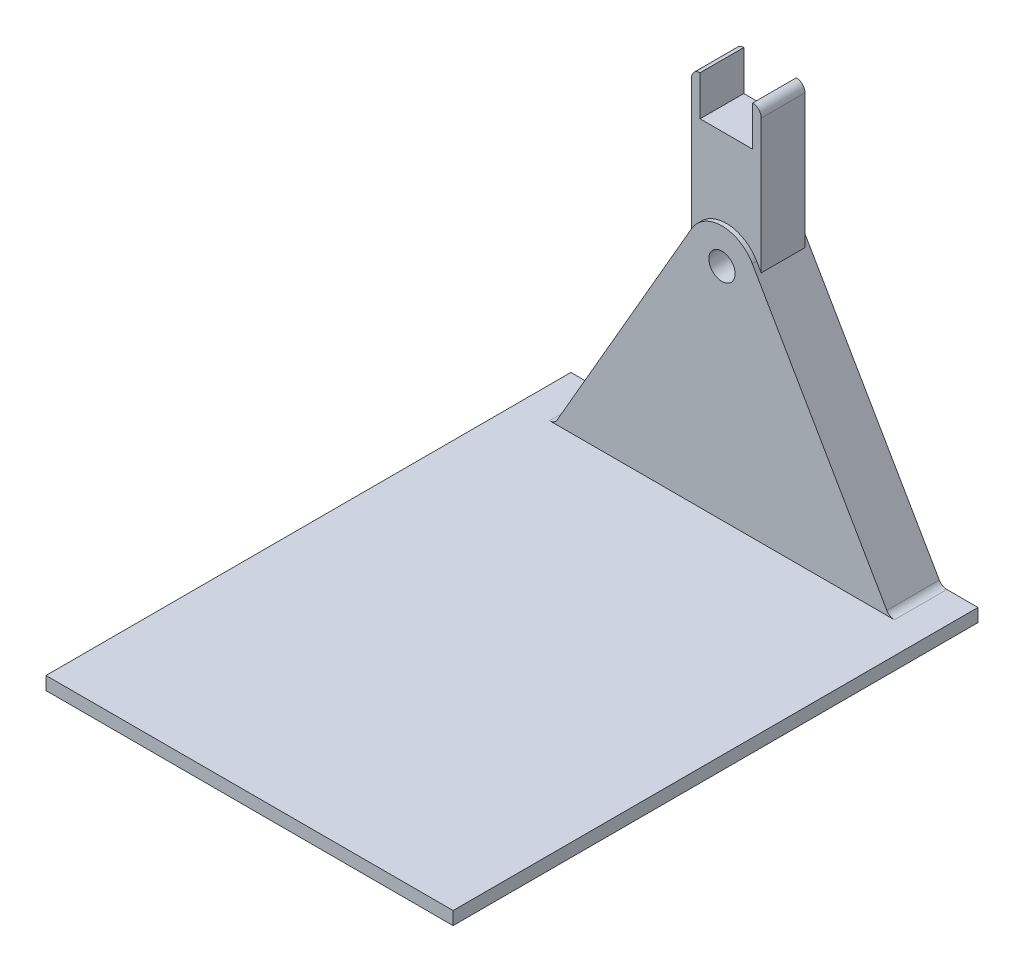
ISO-10303-21;
HEADER;
FILE_DESCRIPTION(('STEP AP214'),'2;1');
FILE_NAME('part.step','',(''),(''),'','','');
FILE_SCHEMA(('AUTOMOTIVE_DESIGN { 1 0 10303 214 1 1 1 1 }'));
ENDSEC;
DATA;
#1=APPLICATION_CONTEXT('core data for automotive mechanical design processes');
#2=APPLICATION_PROTOCOL_DEFINITION('international standard','automotive_design',2000,#1);
#3=PRODUCT_CONTEXT('',#1,'mechanical');
#4=PRODUCT('Part','Part','',(#3));
#5=PRODUCT_RELATED_PRODUCT_CATEGORY('part','',(#4));
#6=PRODUCT_DEFINITION_FORMATION('','',#4);
#7=PRODUCT_DEFINITION_CONTEXT('part definition',#1,'design');
#8=PRODUCT_DEFINITION('design','',#6,#7);
#9=PRODUCT_DEFINITION_SHAPE('','',#8);
#10=(LENGTH_UNIT() NAMED_UNIT(*) SI_UNIT(.MILLI.,.METRE.));
#11=(NAMED_UNIT(*) PLANE_ANGLE_UNIT() SI_UNIT($,.RADIAN.));
#12=(NAMED_UNIT(*) SI_UNIT($,.STERADIAN.) SOLID_ANGLE_UNIT());
#13=UNCERTAINTY_MEASURE_WITH_UNIT(LENGTH_MEASURE(1.E-05),#10,'distance_accuracy_value','');
#14=(GEOMETRIC_REPRESENTATION_CONTEXT(3) GLOBAL_UNCERTAINTY_ASSIGNED_CONTEXT((#13)) GLOBAL_UNIT_ASSIGNED_CONTEXT((#10,
#11,#12)) REPRESENTATION_CONTEXT('',''));
#15=CARTESIAN_POINT('',(0.,0.,0.));
#16=DIRECTION('',(0.,0.,1.));
#17=DIRECTION('',(1.,0.,0.));
#18=AXIS2_PLACEMENT_3D('',#15,#16,#17);
#19=CARTESIAN_POINT('',(0.,8.53692237759738,3.));
#20=DIRECTION('',(0.,0.,-1.));
#21=DIRECTION('',(-1.,0.,0.));
#22=AXIS2_PLACEMENT_3D('',#19,#20,#21);
#23=CYLINDRICAL_SURFACE('',#22,4.);
#24=CARTESIAN_POINT('',(0.,8.53692237759738,-2.5));
#25=DIRECTION('',(0.,0.,1.));
#26=DIRECTION('',(1.,0.,0.));
#27=AXIS2_PLACEMENT_3D('',#24,#25,#26);
#28=CIRCLE('',#27,4.);
#29=CARTESIAN_POINT('',(3.46410161513778,10.5369223775973,-2.5));
#30=VERTEX_POINT('',#29);
#31=CARTESIAN_POINT('',(-3.46410161513778,10.5369223775973,-2.5));
#32=VERTEX_POINT('',#31);
#33=EDGE_CURVE('E274',#30,#32,#28,.T.);
#34=ORIENTED_EDGE('',*,*,#33,.F.);
#35=DIRECTION('',(0.,0.,-1.));
#36=VECTOR('',#35,1.);
#37=CARTESIAN_POINT('',(3.46410161513778,10.5369223775973,3.));
#38=LINE('',#37,#36);
#39=CARTESIAN_POINT('',(3.46410161513778,10.5369223775973,-3.));
#40=VERTEX_POINT('',#39);
#41=EDGE_CURVE('E304',#30,#40,#38,.T.);
#42=ORIENTED_EDGE('',*,*,#41,.T.);
#43=CARTESIAN_POINT('',(0.,8.53692237759738,-3.));
#44=DIRECTION('',(0.,0.,1.));
#45=DIRECTION('',(1.,0.,0.));
#46=AXIS2_PLACEMENT_3D('',#43,#44,#45);
#47=CIRCLE('',#46,4.);
#48=CARTESIAN_POINT('',(-3.46410161513778,10.5369223775973,-3.));
#49=VERTEX_POINT('',#48);
#50=EDGE_CURVE('E294',#40,#49,#47,.T.);
#51=ORIENTED_EDGE('',*,*,#50,.T.);
#52=DIRECTION('',(0.,0.,-1.));
#53=VECTOR('',#52,1.);
#54=CARTESIAN_POINT('',(-3.46410161513778,10.5369223775973,3.));
#55=LINE('',#54,#53);
#56=EDGE_CURVE('E292',#32,#49,#55,.T.);
#57=ORIENTED_EDGE('',*,*,#56,.F.);
#58=EDGE_LOOP('',(#34,#42,#51,#57));
#59=FACE_BOUND('',#58,.T.);
#60=ADVANCED_FACE('F37',(#59),#23,.T.);
#61=CARTESIAN_POINT('',(7.16069743970534,4.13423059439934,3.));
#62=DIRECTION('',(0.866025403784439,0.5,0.));
#63=DIRECTION('',(-0.5,0.866025403784439,0.));
#64=AXIS2_PLACEMENT_3D('',#61,#62,#63);
#65=PLANE('',#64);
#66=DIRECTION('',(0.5,-0.866025403784439,0.));
#67=VECTOR('',#66,1.);
#68=CARTESIAN_POINT('',(7.16069743970534,4.13423059439934,3.));
#69=LINE('',#68,#67);
#70=CARTESIAN_POINT('',(3.46410161513778,10.5369223775973,3.));
#71=VERTEX_POINT('',#70);
#72=CARTESIAN_POINT('',(18.8452994616208,-16.1040937737802,3.));
#73=VERTEX_POINT('',#72);
#74=EDGE_CURVE('E285',#71,#73,#69,.T.);
#75=ORIENTED_EDGE('',*,*,#74,.T.);
#76=DIRECTION('',(0.,0.,-1.));
#77=VECTOR('',#76,1.);
#78=CARTESIAN_POINT('',(18.8452994616207,-16.1040937737802,-3.));
#79=LINE('',#78,#77);
#80=CARTESIAN_POINT('',(18.8452994616208,-16.1040937737802,-3.));
#81=VERTEX_POINT('',#80);
#82=EDGE_CURVE('E323',#73,#81,#79,.T.);
#83=ORIENTED_EDGE('',*,*,#82,.T.);
#84=DIRECTION('',(0.5,-0.866025403784439,0.));
#85=VECTOR('',#84,1.);
#86=CARTESIAN_POINT('',(7.16069743970534,4.13423059439934,-3.));
#87=LINE('',#86,#85);
#88=EDGE_CURVE('E284',#40,#81,#87,.T.);
#89=ORIENTED_EDGE('',*,*,#88,.F.);
#90=ORIENTED_EDGE('',*,*,#41,.F.);
#91=DIRECTION('',(0.5,-0.866025403784439,0.));
#92=VECTOR('',#91,1.);
#93=CARTESIAN_POINT('',(7.16069743970534,4.13423059439934,-2.5));
#94=LINE('',#93,#92);
#95=CARTESIAN_POINT('',(3.98839196034118,9.62882486178722,-2.5));
#96=VERTEX_POINT('',#95);
#97=EDGE_CURVE('E277',#30,#96,#94,.T.);
#98=ORIENTED_EDGE('',*,*,#97,.T.);
#99=DIRECTION('',(0.,0.,1.));
#100=VECTOR('',#99,1.);
#101=CARTESIAN_POINT('',(3.98839196034118,9.62882486178722,3.));
#102=LINE('',#101,#100);
#103=CARTESIAN_POINT('',(3.98839196034118,9.62882486178722,2.5));
#104=VERTEX_POINT('',#103);
#105=EDGE_CURVE('E315',#96,#104,#102,.T.);
#106=ORIENTED_EDGE('',*,*,#105,.T.);
#107=DIRECTION('',(0.5,-0.866025403784439,0.));
#108=VECTOR('',#107,1.);
#109=CARTESIAN_POINT('',(7.16069743970534,4.13423059439934,2.5));
#110=LINE('',#109,#108);
#111=CARTESIAN_POINT('',(3.46410161513778,10.5369223775973,2.5));
#112=VERTEX_POINT('',#111);
#113=EDGE_CURVE('E281',#112,#104,#110,.T.);
#114=ORIENTED_EDGE('',*,*,#113,.F.);
#115=EDGE_CURVE('E305',#71,#112,#38,.T.);
#116=ORIENTED_EDGE('',*,*,#115,.F.);
#117=EDGE_LOOP('',(#75,#83,#89,#90,#98,#106,#114,#116));
#118=FACE_BOUND('',#117,.T.);
#119=ADVANCED_FACE('F335',(#118),#65,.T.);
#120=ORIENTED_EDGE('',*,*,#115,.T.);
#121=CARTESIAN_POINT('',(0.,8.53692237759738,2.5));
#122=DIRECTION('',(0.,0.,1.));
#123=DIRECTION('',(1.,0.,0.));
#124=AXIS2_PLACEMENT_3D('',#121,#122,#123);
#125=CIRCLE('',#124,4.);
#126=CARTESIAN_POINT('',(-3.46410161513778,10.5369223775973,2.5));
#127=VERTEX_POINT('',#126);
#128=EDGE_CURVE('E279',#112,#127,#125,.T.);
#129=ORIENTED_EDGE('',*,*,#128,.T.);
#130=CARTESIAN_POINT('',(-3.46410161513778,10.5369223775973,3.));
#131=VERTEX_POINT('',#130);
#132=EDGE_CURVE('E301',#131,#127,#55,.T.);
#133=ORIENTED_EDGE('',*,*,#132,.F.);
#134=CARTESIAN_POINT('',(0.,8.53692237759738,3.));
#135=DIRECTION('',(0.,0.,1.));
#136=DIRECTION('',(1.,0.,0.));
#137=AXIS2_PLACEMENT_3D('',#134,#135,#136);
#138=CIRCLE('',#137,4.);
#139=EDGE_CURVE('E287',#71,#131,#138,.T.);
#140=ORIENTED_EDGE('',*,*,#139,.F.);
#141=EDGE_LOOP('',(#120,#129,#133,#140));
#142=FACE_BOUND('',#141,.T.);
#143=ADVANCED_FACE('F343',(#142),#23,.T.);
#144=CARTESIAN_POINT('',(-7.16069743970534,4.13423059439934,3.));
#145=DIRECTION('',(0.866025403784439,-0.5,0.));
#146=DIRECTION('',(0.5,0.866025403784439,0.));
#147=AXIS2_PLACEMENT_3D('',#144,#145,#146);
#148=PLANE('',#147);
#149=DIRECTION('',(-0.5,-0.866025403784439,0.));
#150=VECTOR('',#149,1.);
#151=CARTESIAN_POINT('',(-7.16069743970534,4.13423059439934,-3.));
#152=LINE('',#151,#150);
#153=CARTESIAN_POINT('',(-18.8452994616207,-16.1040937737802,-3.));
#154=VERTEX_POINT('',#153);
#155=EDGE_CURVE('E297',#49,#154,#152,.T.);
#156=ORIENTED_EDGE('',*,*,#155,.T.);
#157=DIRECTION('',(0.,0.,-1.));
#158=VECTOR('',#157,1.);
#159=CARTESIAN_POINT('',(-18.8452994616207,-16.1040937737802,3.));
#160=LINE('',#159,#158);
#161=CARTESIAN_POINT('',(-18.8452994616207,-16.1040937737802,3.));
#162=VERTEX_POINT('',#161);
#163=EDGE_CURVE('E321',#154,#162,#160,.F.);
#164=ORIENTED_EDGE('',*,*,#163,.T.);
#165=DIRECTION('',(-0.5,-0.866025403784439,0.));
#166=VECTOR('',#165,1.);
#167=CARTESIAN_POINT('',(-7.16069743970534,4.13423059439934,3.));
#168=LINE('',#167,#166);
#169=EDGE_CURVE('E289',#131,#162,#168,.T.);
#170=ORIENTED_EDGE('',*,*,#169,.F.);
#171=ORIENTED_EDGE('',*,*,#132,.T.);
#172=DIRECTION('',(-0.5,-0.866025403784439,0.));
#173=VECTOR('',#172,1.);
#174=CARTESIAN_POINT('',(-7.16069743970534,4.13423059439934,2.5));
#175=LINE('',#174,#173);
#176=CARTESIAN_POINT('',(-3.98839196034118,9.62882486178722,2.5));
#177=VERTEX_POINT('',#176);
#178=EDGE_CURVE('E313',#127,#177,#175,.T.);
#179=ORIENTED_EDGE('',*,*,#178,.T.);
#180=DIRECTION('',(0.,0.,-1.));
#181=VECTOR('',#180,1.);
#182=CARTESIAN_POINT('',(-3.98839196034118,9.62882486178722,3.));
#183=LINE('',#182,#181);
#184=CARTESIAN_POINT('',(-3.98839196034118,9.62882486178722,-2.5));
#185=VERTEX_POINT('',#184);
#186=EDGE_CURVE('E311',#177,#185,#183,.T.);
#187=ORIENTED_EDGE('',*,*,#186,.T.);
#188=DIRECTION('',(-0.5,-0.866025403784439,0.));
#189=VECTOR('',#188,1.);
#190=CARTESIAN_POINT('',(-7.16069743970534,4.13423059439934,-2.5));
#191=LINE('',#190,#189);
#192=EDGE_CURVE('E308',#32,#185,#191,.T.);
#193=ORIENTED_EDGE('',*,*,#192,.F.);
#194=ORIENTED_EDGE('',*,*,#56,.T.);
#195=EDGE_LOOP('',(#156,#164,#170,#171,#179,#187,#193,#194));
#196=FACE_BOUND('',#195,.T.);
#197=ADVANCED_FACE('F347',(#196),#148,.F.);
#198=CARTESIAN_POINT('',(0.,-18.1040937737802,3.));
#199=DIRECTION('',(0.,1.,0.));
#200=DIRECTION('',(0.,0.,1.));
#201=AXIS2_PLACEMENT_3D('',#198,#199,#200);
#202=PLANE('',#201);
#203=DIRECTION('',(0.,0.,-1.));
#204=VECTOR('',#203,1.);
#205=CARTESIAN_POINT('',(-23.2679491924311,-18.1040937737802,-3.));
#206=LINE('',#205,#204);
#207=CARTESIAN_POINT('',(-23.2679491924311,-18.1040937737802,57.));
#208=VERTEX_POINT('',#207);
#209=CARTESIAN_POINT('',(-23.2679491924311,-18.1040937737802,-3.));
#210=VERTEX_POINT('',#209);
#211=EDGE_CURVE('E213',#208,#210,#206,.T.);
#212=ORIENTED_EDGE('',*,*,#211,.T.);
#213=DIRECTION('',(1.,0.,0.));
#214=VECTOR('',#213,1.);
#215=CARTESIAN_POINT('',(0.,-18.1040937737802,-3.));
#216=LINE('',#215,#214);
#217=CARTESIAN_POINT('',(23.2679491924311,-18.1040937737802,-3.));
#218=VERTEX_POINT('',#217);
#219=EDGE_CURVE('E179',#210,#218,#216,.T.);
#220=ORIENTED_EDGE('',*,*,#219,.T.);
#221=DIRECTION('',(0.,0.,1.));
#222=VECTOR('',#221,1.);
#223=CARTESIAN_POINT('',(23.2679491924311,-18.1040937737802,-3.));
#224=LINE('',#223,#222);
#225=CARTESIAN_POINT('',(23.2679491924311,-18.1040937737802,57.));
#226=VERTEX_POINT('',#225);
#227=EDGE_CURVE('E204',#218,#226,#224,.T.);
#228=ORIENTED_EDGE('',*,*,#227,.T.);
#229=DIRECTION('',(-1.,0.,0.));
#230=VECTOR('',#229,1.);
#231=CARTESIAN_POINT('',(-23.2679491924311,-18.1040937737802,57.));
#232=LINE('',#231,#230);
#233=EDGE_CURVE('E201',#226,#208,#232,.T.);
#234=ORIENTED_EDGE('',*,*,#233,.T.);
#235=EDGE_LOOP('',(#212,#220,#228,#234));
#236=FACE_BOUND('',#235,.T.);
#237=ADVANCED_FACE('F412',(#236),#202,.F.);
#238=CARTESIAN_POINT('',(0.,0.,3.));
#239=DIRECTION('',(0.,0.,1.));
#240=DIRECTION('',(1.,0.,0.));
#241=AXIS2_PLACEMENT_3D('',#238,#239,#240);
#242=PLANE('',#241);
#243=CARTESIAN_POINT('',(0.,8.53692237759738,3.));
#244=DIRECTION('',(0.,0.,1.));
#245=DIRECTION('',(1.,0.,0.));
#246=AXIS2_PLACEMENT_3D('',#243,#244,#245);
#247=CIRCLE('',#246,1.5);
#248=CARTESIAN_POINT('',(1.5,8.53692237759738,3.));
#249=VERTEX_POINT('',#248);
#250=EDGE_CURVE('E207',#249,#249,#247,.T.);
#251=ORIENTED_EDGE('',*,*,#250,.F.);
#252=EDGE_LOOP('',(#251));
#253=FACE_BOUND('',#252,.T.);
#254=DIRECTION('',(-1.,0.,0.));
#255=VECTOR('',#254,1.);
#256=CARTESIAN_POINT('',(0.,-16.6040937737802,3.));
#257=LINE('',#256,#255);
#258=CARTESIAN_POINT('',(19.7113248654052,-16.6040937737802,3.));
#259=VERTEX_POINT('',#258);
#260=CARTESIAN_POINT('',(-19.7113248654052,-16.6040937737802,3.));
#261=VERTEX_POINT('',#260);
#262=EDGE_CURVE('E218',#259,#261,#257,.T.);
#263=ORIENTED_EDGE('',*,*,#262,.F.);
#264=CARTESIAN_POINT('',(19.7113248654052,-15.6040937737802,3.));
#265=DIRECTION('',(0.,0.,1.));
#266=DIRECTION('',(1.,0.,0.));
#267=AXIS2_PLACEMENT_3D('',#264,#265,#266);
#268=CIRCLE('',#267,1.);
#269=EDGE_CURVE('E11',#259,#73,#268,.F.);
#270=ORIENTED_EDGE('',*,*,#269,.T.);
#271=ORIENTED_EDGE('',*,*,#74,.F.);
#272=ORIENTED_EDGE('',*,*,#139,.T.);
#273=ORIENTED_EDGE('',*,*,#169,.T.);
#274=CARTESIAN_POINT('',(-19.7113248654052,-15.6040937737802,3.));
#275=DIRECTION('',(0.,0.,1.));
#276=DIRECTION('',(1.,0.,0.));
#277=AXIS2_PLACEMENT_3D('',#274,#275,#276);
#278=CIRCLE('',#277,1.);
#279=EDGE_CURVE('E327',#162,#261,#278,.F.);
#280=ORIENTED_EDGE('',*,*,#279,.T.);
#281=EDGE_LOOP('',(#263,#270,#271,#272,#273,#280));
#282=FACE_BOUND('',#281,.T.);
#283=ADVANCED_FACE('F338',(#253,#282),#242,.T.);
#284=CARTESIAN_POINT('',(0.,0.,-3.));
#285=DIRECTION('',(0.,0.,1.));
#286=DIRECTION('',(1.,0.,0.));
#287=AXIS2_PLACEMENT_3D('',#284,#285,#286);
#288=PLANE('',#287);
#289=CARTESIAN_POINT('',(0.,8.53692237759738,-3.));
#290=DIRECTION('',(0.,0.,-1.));
#291=DIRECTION('',(-1.,0.,0.));
#292=AXIS2_PLACEMENT_3D('',#289,#290,#291);
#293=CIRCLE('',#292,1.5);
#294=CARTESIAN_POINT('',(-1.5,8.53692237759738,-3.));
#295=VERTEX_POINT('',#294);
#296=EDGE_CURVE('E596',#295,#295,#293,.T.);
#297=ORIENTED_EDGE('',*,*,#296,.F.);
#298=EDGE_LOOP('',(#297));
#299=FACE_BOUND('',#298,.T.);
#300=ORIENTED_EDGE('',*,*,#88,.T.);
#301=CARTESIAN_POINT('',(19.7113248654052,-15.6040937737802,-3.));
#302=DIRECTION('',(0.,0.,1.));
#303=DIRECTION('',(1.,0.,0.));
#304=AXIS2_PLACEMENT_3D('',#301,#302,#303);
#305=CIRCLE('',#304,1.);
#306=CARTESIAN_POINT('',(19.7113248654052,-16.6040937737802,-3.));
#307=VERTEX_POINT('',#306);
#308=EDGE_CURVE('E45',#81,#307,#305,.T.);
#309=ORIENTED_EDGE('',*,*,#308,.T.);
#310=DIRECTION('',(1.,0.,0.));
#311=VECTOR('',#310,1.);
#312=CARTESIAN_POINT('',(-23.2679491924311,-16.6040937737802,-3.));
#313=LINE('',#312,#311);
#314=CARTESIAN_POINT('',(23.2679491924311,-16.6040937737802,-3.));
#315=VERTEX_POINT('',#314);
#316=EDGE_CURVE('E197',#307,#315,#313,.T.);
#317=ORIENTED_EDGE('',*,*,#316,.T.);
#318=DIRECTION('',(0.,-1.,0.));
#319=VECTOR('',#318,1.);
#320=CARTESIAN_POINT('',(23.2679491924311,-16.6040937737802,-3.));
#321=LINE('',#320,#319);
#322=EDGE_CURVE('E184',#315,#218,#321,.T.);
#323=ORIENTED_EDGE('',*,*,#322,.T.);
#324=ORIENTED_EDGE('',*,*,#219,.F.);
#325=DIRECTION('',(0.,-1.,0.));
#326=VECTOR('',#325,1.);
#327=CARTESIAN_POINT('',(-23.2679491924311,-16.6040937737802,-3.));
#328=LINE('',#327,#326);
#329=CARTESIAN_POINT('',(-23.2679491924311,-16.6040937737802,-3.));
#330=VERTEX_POINT('',#329);
#331=EDGE_CURVE('E173',#330,#210,#328,.T.);
#332=ORIENTED_EDGE('',*,*,#331,.F.);
#333=CARTESIAN_POINT('',(-19.7113248654052,-16.6040937737802,-3.));
#334=VERTEX_POINT('',#333);
#335=EDGE_CURVE('E177',#330,#334,#313,.T.);
#336=ORIENTED_EDGE('',*,*,#335,.T.);
#337=CARTESIAN_POINT('',(-19.7113248654052,-15.6040937737802,-3.));
#338=DIRECTION('',(0.,0.,1.));
#339=DIRECTION('',(1.,0.,0.));
#340=AXIS2_PLACEMENT_3D('',#337,#338,#339);
#341=CIRCLE('',#340,1.);
#342=EDGE_CURVE('E325',#334,#154,#341,.T.);
#343=ORIENTED_EDGE('',*,*,#342,.T.);
#344=ORIENTED_EDGE('',*,*,#155,.F.);
#345=ORIENTED_EDGE('',*,*,#50,.F.);
#346=EDGE_LOOP('',(#300,#309,#317,#323,#324,#332,#336,#343,#344,#345));
#347=FACE_BOUND('',#346,.T.);
#348=ADVANCED_FACE('F176',(#299,#347),#288,.F.);
#349=CARTESIAN_POINT('',(-3.98839196034118,0.,2.5));
#350=DIRECTION('',(-1.,0.,0.));
#351=DIRECTION('',(0.,0.,1.));
#352=AXIS2_PLACEMENT_3D('',#349,#350,#351);
#353=PLANE('',#352);
#354=ORIENTED_EDGE('',*,*,#186,.F.);
#355=DIRECTION('',(0.,1.,0.));
#356=VECTOR('',#355,1.);
#357=CARTESIAN_POINT('',(-3.98839196034118,0.,2.5));
#358=LINE('',#357,#356);
#359=CARTESIAN_POINT('',(-3.98839196034118,24.9475640006754,2.5));
#360=VERTEX_POINT('',#359);
#361=EDGE_CURVE('E239',#177,#360,#358,.T.);
#362=ORIENTED_EDGE('',*,*,#361,.T.);
#363=DIRECTION('',(0.,0.,-1.));
#364=VECTOR('',#363,1.);
#365=CARTESIAN_POINT('',(-3.98839196034118,24.9475640006754,2.5));
#366=LINE('',#365,#364);
#367=CARTESIAN_POINT('',(-3.98839196034118,24.9475640006754,-2.5));
#368=VERTEX_POINT('',#367);
#369=EDGE_CURVE('E263',#360,#368,#366,.T.);
#370=ORIENTED_EDGE('',*,*,#369,.T.);
#371=DIRECTION('',(0.,1.,0.));
#372=VECTOR('',#371,1.);
#373=CARTESIAN_POINT('',(-3.98839196034118,0.,-2.5));
#374=LINE('',#373,#372);
#375=EDGE_CURVE('E258',#185,#368,#374,.T.);
#376=ORIENTED_EDGE('',*,*,#375,.F.);
#377=EDGE_LOOP('',(#354,#362,#370,#376));
#378=FACE_BOUND('',#377,.T.);
#379=ADVANCED_FACE('F377',(#378),#353,.T.);
#380=CARTESIAN_POINT('',(2.98839196034118,24.9475640006754,2.5));
#381=DIRECTION('',(0.,0.,-1.));
#382=DIRECTION('',(-1.,0.,0.));
#383=AXIS2_PLACEMENT_3D('',#380,#381,#382);
#384=CYLINDRICAL_SURFACE('',#383,1.);
#385=CARTESIAN_POINT('',(2.98839196034118,24.9475640006754,-2.5));
#386=DIRECTION('',(0.,0.,1.));
#387=DIRECTION('',(1.,0.,0.));
#388=AXIS2_PLACEMENT_3D('',#385,#386,#387);
#389=CIRCLE('',#388,1.);
#390=CARTESIAN_POINT('',(3.,25.9474966251133,-2.5));
#391=VERTEX_POINT('',#390);
#392=CARTESIAN_POINT('',(3.98839196034118,24.9475640006754,-2.5));
#393=VERTEX_POINT('',#392);
#394=EDGE_CURVE('E223',#391,#393,#389,.F.);
#395=ORIENTED_EDGE('',*,*,#394,.F.);
#396=DIRECTION('',(0.,0.,-1.));
#397=VECTOR('',#396,1.);
#398=CARTESIAN_POINT('',(3.,25.9474966251133,2.5));
#399=LINE('',#398,#397);
#400=CARTESIAN_POINT('',(3.,25.9474966251133,2.5));
#401=VERTEX_POINT('',#400);
#402=EDGE_CURVE('E272',#401,#391,#399,.T.);
#403=ORIENTED_EDGE('',*,*,#402,.F.);
#404=CARTESIAN_POINT('',(2.98839196034118,24.9475640006754,2.5));
#405=DIRECTION('',(0.,0.,1.));
#406=DIRECTION('',(1.,0.,0.));
#407=AXIS2_PLACEMENT_3D('',#404,#405,#406);
#408=CIRCLE('',#407,1.);
#409=CARTESIAN_POINT('',(3.98839196034118,24.9475640006754,2.5));
#410=VERTEX_POINT('',#409);
#411=EDGE_CURVE('E224',#401,#410,#408,.F.);
#412=ORIENTED_EDGE('',*,*,#411,.T.);
#413=DIRECTION('',(0.,0.,-1.));
#414=VECTOR('',#413,1.);
#415=CARTESIAN_POINT('',(3.98839196034118,24.9475640006754,2.5));
#416=LINE('',#415,#414);
#417=EDGE_CURVE('E243',#410,#393,#416,.T.);
#418=ORIENTED_EDGE('',*,*,#417,.T.);
#419=EDGE_LOOP('',(#395,#403,#412,#418));
#420=FACE_BOUND('',#419,.T.);
#421=ADVANCED_FACE('F366',(#420),#384,.T.);
#422=CARTESIAN_POINT('',(3.,0.,2.5));
#423=DIRECTION('',(1.,0.,0.));
#424=DIRECTION('',(0.,0.,-1.));
#425=AXIS2_PLACEMENT_3D('',#422,#423,#424);
#426=PLANE('',#425);
#427=DIRECTION('',(0.,-1.,0.));
#428=VECTOR('',#427,1.);
#429=CARTESIAN_POINT('',(3.,0.,-2.5));
#430=LINE('',#429,#428);
#431=CARTESIAN_POINT('',(3.,21.3865391829273,-2.5));
#432=VERTEX_POINT('',#431);
#433=EDGE_CURVE('E246',#391,#432,#430,.T.);
#434=ORIENTED_EDGE('',*,*,#433,.T.);
#435=DIRECTION('',(0.,0.,-1.));
#436=VECTOR('',#435,1.);
#437=CARTESIAN_POINT('',(3.,21.3865391829273,2.5));
#438=LINE('',#437,#436);
#439=CARTESIAN_POINT('',(3.,21.3865391829273,2.5));
#440=VERTEX_POINT('',#439);
#441=EDGE_CURVE('E270',#440,#432,#438,.T.);
#442=ORIENTED_EDGE('',*,*,#441,.F.);
#443=DIRECTION('',(0.,-1.,0.));
#444=VECTOR('',#443,1.);
#445=CARTESIAN_POINT('',(3.,0.,2.5));
#446=LINE('',#445,#444);
#447=EDGE_CURVE('E227',#401,#440,#446,.T.);
#448=ORIENTED_EDGE('',*,*,#447,.F.);
#449=ORIENTED_EDGE('',*,*,#402,.T.);
#450=EDGE_LOOP('',(#434,#442,#448,#449));
#451=FACE_BOUND('',#450,.T.);
#452=ADVANCED_FACE('F390',(#451),#426,.F.);
#453=CARTESIAN_POINT('',(0.,21.3865391829273,2.5));
#454=DIRECTION('',(0.,1.,0.));
#455=DIRECTION('',(0.,0.,1.));
#456=AXIS2_PLACEMENT_3D('',#453,#454,#455);
#457=PLANE('',#456);
#458=DIRECTION('',(1.,0.,0.));
#459=VECTOR('',#458,1.);
#460=CARTESIAN_POINT('',(0.,21.3865391829273,-2.5));
#461=LINE('',#460,#459);
#462=CARTESIAN_POINT('',(-3.,21.3865391829273,-2.5));
#463=VERTEX_POINT('',#462);
#464=EDGE_CURVE('E249',#463,#432,#461,.T.);
#465=ORIENTED_EDGE('',*,*,#464,.F.);
#466=DIRECTION('',(0.,0.,-1.));
#467=VECTOR('',#466,1.);
#468=CARTESIAN_POINT('',(-3.,21.3865391829273,2.5));
#469=LINE('',#468,#467);
#470=CARTESIAN_POINT('',(-3.,21.3865391829273,2.5));
#471=VERTEX_POINT('',#470);
#472=EDGE_CURVE('E268',#471,#463,#469,.T.);
#473=ORIENTED_EDGE('',*,*,#472,.F.);
#474=DIRECTION('',(1.,0.,0.));
#475=VECTOR('',#474,1.);
#476=CARTESIAN_POINT('',(0.,21.3865391829273,2.5));
#477=LINE('',#476,#475);
#478=EDGE_CURVE('E230',#471,#440,#477,.T.);
#479=ORIENTED_EDGE('',*,*,#478,.T.);
#480=ORIENTED_EDGE('',*,*,#441,.T.);
#481=EDGE_LOOP('',(#465,#473,#479,#480));
#482=FACE_BOUND('',#481,.T.);
#483=ADVANCED_FACE('F388',(#482),#457,.T.);
#484=CARTESIAN_POINT('',(-3.,0.,2.5));
#485=DIRECTION('',(1.,0.,0.));
#486=DIRECTION('',(0.,1.,0.));
#487=AXIS2_PLACEMENT_3D('',#484,#485,#486);
#488=PLANE('',#487);
#489=DIRECTION('',(0.,-1.,0.));
#490=VECTOR('',#489,1.);
#491=CARTESIAN_POINT('',(-3.,0.,-2.5));
#492=LINE('',#491,#490);
#493=CARTESIAN_POINT('',(-3.,25.9474966251133,-2.5));
#494=VERTEX_POINT('',#493);
#495=EDGE_CURVE('E252',#494,#463,#492,.T.);
#496=ORIENTED_EDGE('',*,*,#495,.F.);
#497=DIRECTION('',(0.,0.,-1.));
#498=VECTOR('',#497,1.);
#499=CARTESIAN_POINT('',(-3.,25.9474966251133,2.5));
#500=LINE('',#499,#498);
#501=CARTESIAN_POINT('',(-3.,25.9474966251133,2.5));
#502=VERTEX_POINT('',#501);
#503=EDGE_CURVE('E266',#502,#494,#500,.T.);
#504=ORIENTED_EDGE('',*,*,#503,.F.);
#505=DIRECTION('',(0.,-1.,0.));
#506=VECTOR('',#505,1.);
#507=CARTESIAN_POINT('',(-3.,0.,2.5));
#508=LINE('',#507,#506);
#509=EDGE_CURVE('E233',#502,#471,#508,.T.);
#510=ORIENTED_EDGE('',*,*,#509,.T.);
#511=ORIENTED_EDGE('',*,*,#472,.T.);
#512=EDGE_LOOP('',(#496,#504,#510,#511));
#513=FACE_BOUND('',#512,.T.);
#514=ADVANCED_FACE('F383',(#513),#488,.T.);
#515=CARTESIAN_POINT('',(-2.98839196034118,24.9475640006754,2.5));
#516=DIRECTION('',(0.,0.,-1.));
#517=DIRECTION('',(-1.,0.,0.));
#518=AXIS2_PLACEMENT_3D('',#515,#516,#517);
#519=CYLINDRICAL_SURFACE('',#518,1.);
#520=CARTESIAN_POINT('',(-2.98839196034118,24.9475640006754,-2.5));
#521=DIRECTION('',(0.,0.,1.));
#522=DIRECTION('',(1.,0.,0.));
#523=AXIS2_PLACEMENT_3D('',#520,#521,#522);
#524=CIRCLE('',#523,1.);
#525=EDGE_CURVE('E255',#494,#368,#524,.T.);
#526=ORIENTED_EDGE('',*,*,#525,.T.);
#527=ORIENTED_EDGE('',*,*,#369,.F.);
#528=CARTESIAN_POINT('',(-2.98839196034118,24.9475640006754,2.5));
#529=DIRECTION('',(0.,0.,1.));
#530=DIRECTION('',(1.,0.,0.));
#531=AXIS2_PLACEMENT_3D('',#528,#529,#530);
#532=CIRCLE('',#531,1.);
#533=EDGE_CURVE('E236',#502,#360,#532,.T.);
#534=ORIENTED_EDGE('',*,*,#533,.F.);
#535=ORIENTED_EDGE('',*,*,#503,.T.);
#536=EDGE_LOOP('',(#526,#527,#534,#535));
#537=FACE_BOUND('',#536,.T.);
#538=ADVANCED_FACE('F391',(#537),#519,.T.);
#539=CARTESIAN_POINT('',(3.98839196034118,0.,2.5));
#540=DIRECTION('',(-1.,0.,0.));
#541=DIRECTION('',(0.,0.,1.));
#542=AXIS2_PLACEMENT_3D('',#539,#540,#541);
#543=PLANE('',#542);
#544=ORIENTED_EDGE('',*,*,#105,.F.);
#545=DIRECTION('',(0.,1.,0.));
#546=VECTOR('',#545,1.);
#547=CARTESIAN_POINT('',(3.98839196034118,0.,-2.5));
#548=LINE('',#547,#546);
#549=EDGE_CURVE('E228',#96,#393,#548,.T.);
#550=ORIENTED_EDGE('',*,*,#549,.T.);
#551=ORIENTED_EDGE('',*,*,#417,.F.);
#552=DIRECTION('',(0.,1.,0.));
#553=VECTOR('',#552,1.);
#554=CARTESIAN_POINT('',(3.98839196034118,0.,2.5));
#555=LINE('',#554,#553);
#556=EDGE_CURVE('E241',#104,#410,#555,.T.);
#557=ORIENTED_EDGE('',*,*,#556,.F.);
#558=EDGE_LOOP('',(#544,#550,#551,#557));
#559=FACE_BOUND('',#558,.T.);
#560=ADVANCED_FACE('F363',(#559),#543,.F.);
#561=CARTESIAN_POINT('',(0.,0.,2.5));
#562=DIRECTION('',(0.,0.,1.));
#563=DIRECTION('',(1.,0.,0.));
#564=AXIS2_PLACEMENT_3D('',#561,#562,#563);
#565=PLANE('',#564);
#566=ORIENTED_EDGE('',*,*,#128,.F.);
#567=ORIENTED_EDGE('',*,*,#113,.T.);
#568=ORIENTED_EDGE('',*,*,#556,.T.);
#569=ORIENTED_EDGE('',*,*,#411,.F.);
#570=ORIENTED_EDGE('',*,*,#447,.T.);
#571=ORIENTED_EDGE('',*,*,#478,.F.);
#572=ORIENTED_EDGE('',*,*,#509,.F.);
#573=ORIENTED_EDGE('',*,*,#533,.T.);
#574=ORIENTED_EDGE('',*,*,#361,.F.);
#575=ORIENTED_EDGE('',*,*,#178,.F.);
#576=EDGE_LOOP('',(#566,#567,#568,#569,#570,#571,#572,#573,#574,#575));
#577=FACE_BOUND('',#576,.T.);
#578=ADVANCED_FACE('F370',(#577),#565,.T.);
#579=CARTESIAN_POINT('',(0.,0.,-2.5));
#580=DIRECTION('',(0.,0.,1.));
#581=DIRECTION('',(1.,0.,0.));
#582=AXIS2_PLACEMENT_3D('',#579,#580,#581);
#583=PLANE('',#582);
#584=ORIENTED_EDGE('',*,*,#97,.F.);
#585=ORIENTED_EDGE('',*,*,#33,.T.);
#586=ORIENTED_EDGE('',*,*,#192,.T.);
#587=ORIENTED_EDGE('',*,*,#375,.T.);
#588=ORIENTED_EDGE('',*,*,#525,.F.);
#589=ORIENTED_EDGE('',*,*,#495,.T.);
#590=ORIENTED_EDGE('',*,*,#464,.T.);
#591=ORIENTED_EDGE('',*,*,#433,.F.);
#592=ORIENTED_EDGE('',*,*,#394,.T.);
#593=ORIENTED_EDGE('',*,*,#549,.F.);
#594=EDGE_LOOP('',(#584,#585,#586,#587,#588,#589,#590,#591,#592,#593));
#595=FACE_BOUND('',#594,.T.);
#596=ADVANCED_FACE('F358',(#595),#583,.F.);
#597=CARTESIAN_POINT('',(0.,-16.6040937737802,0.));
#598=DIRECTION('',(0.,1.,0.));
#599=DIRECTION('',(0.,0.,1.));
#600=AXIS2_PLACEMENT_3D('',#597,#598,#599);
#601=PLANE('',#600);
#602=ORIENTED_EDGE('',*,*,#262,.T.);
#603=DIRECTION('',(0.,0.,-1.));
#604=VECTOR('',#603,1.);
#605=CARTESIAN_POINT('',(-19.7113248654052,-16.6040937737802,0.));
#606=LINE('',#605,#604);
#607=EDGE_CURVE('E195',#261,#334,#606,.T.);
#608=ORIENTED_EDGE('',*,*,#607,.T.);
#609=ORIENTED_EDGE('',*,*,#335,.F.);
#610=DIRECTION('',(0.,0.,-1.));
#611=VECTOR('',#610,1.);
#612=CARTESIAN_POINT('',(-23.2679491924311,-16.6040937737802,-3.));
#613=LINE('',#612,#611);
#614=CARTESIAN_POINT('',(-23.2679491924311,-16.6040937737802,57.));
#615=VERTEX_POINT('',#614);
#616=EDGE_CURVE('E192',#615,#330,#613,.T.);
#617=ORIENTED_EDGE('',*,*,#616,.F.);
#618=DIRECTION('',(-1.,0.,0.));
#619=VECTOR('',#618,1.);
#620=CARTESIAN_POINT('',(-23.2679491924311,-16.6040937737802,57.));
#621=LINE('',#620,#619);
#622=CARTESIAN_POINT('',(23.2679491924311,-16.6040937737802,57.));
#623=VERTEX_POINT('',#622);
#624=EDGE_CURVE('E185',#623,#615,#621,.T.);
#625=ORIENTED_EDGE('',*,*,#624,.F.);
#626=DIRECTION('',(0.,0.,1.));
#627=VECTOR('',#626,1.);
#628=CARTESIAN_POINT('',(23.2679491924311,-16.6040937737802,-3.));
#629=LINE('',#628,#627);
#630=EDGE_CURVE('E196',#315,#623,#629,.T.);
#631=ORIENTED_EDGE('',*,*,#630,.F.);
#632=ORIENTED_EDGE('',*,*,#316,.F.);
#633=DIRECTION('',(0.,0.,-1.));
#634=VECTOR('',#633,1.);
#635=CARTESIAN_POINT('',(19.7113248654052,-16.6040937737802,3.));
#636=LINE('',#635,#634);
#637=EDGE_CURVE('E317',#307,#259,#636,.F.);
#638=ORIENTED_EDGE('',*,*,#637,.T.);
#639=EDGE_LOOP('',(#602,#608,#609,#617,#625,#631,#632,#638));
#640=FACE_BOUND('',#639,.T.);
#641=ADVANCED_FACE('F190',(#640),#601,.T.);
#642=CARTESIAN_POINT('',(-23.2679491924311,-16.6040937737802,-3.));
#643=DIRECTION('',(-1.,0.,0.));
#644=DIRECTION('',(0.,0.,1.));
#645=AXIS2_PLACEMENT_3D('',#642,#643,#644);
#646=PLANE('',#645);
#647=ORIENTED_EDGE('',*,*,#211,.F.);
#648=DIRECTION('',(0.,-1.,0.));
#649=VECTOR('',#648,1.);
#650=CARTESIAN_POINT('',(-23.2679491924311,-16.6040937737802,57.));
#651=LINE('',#650,#649);
#652=EDGE_CURVE('E200',#615,#208,#651,.T.);
#653=ORIENTED_EDGE('',*,*,#652,.F.);
#654=ORIENTED_EDGE('',*,*,#616,.T.);
#655=ORIENTED_EDGE('',*,*,#331,.T.);
#656=EDGE_LOOP('',(#647,#653,#654,#655));
#657=FACE_BOUND('',#656,.T.);
#658=ADVANCED_FACE('F199',(#657),#646,.T.);
#659=CARTESIAN_POINT('',(-23.2679491924311,-16.6040937737802,57.));
#660=DIRECTION('',(0.,0.,1.));
#661=DIRECTION('',(1.,0.,0.));
#662=AXIS2_PLACEMENT_3D('',#659,#660,#661);
#663=PLANE('',#662);
#664=ORIENTED_EDGE('',*,*,#233,.F.);
#665=DIRECTION('',(0.,-1.,0.));
#666=VECTOR('',#665,1.);
#667=CARTESIAN_POINT('',(23.2679491924311,-16.6040937737802,57.));
#668=LINE('',#667,#666);
#669=EDGE_CURVE('E219',#623,#226,#668,.T.);
#670=ORIENTED_EDGE('',*,*,#669,.F.);
#671=ORIENTED_EDGE('',*,*,#624,.T.);
#672=ORIENTED_EDGE('',*,*,#652,.T.);
#673=EDGE_LOOP('',(#664,#670,#671,#672));
#674=FACE_BOUND('',#673,.T.);
#675=ADVANCED_FACE('F482',(#674),#663,.T.);
#676=CARTESIAN_POINT('',(23.2679491924311,-16.6040937737802,-3.));
#677=DIRECTION('',(1.,0.,0.));
#678=DIRECTION('',(0.,0.,-1.));
#679=AXIS2_PLACEMENT_3D('',#676,#677,#678);
#680=PLANE('',#679);
#681=ORIENTED_EDGE('',*,*,#227,.F.);
#682=ORIENTED_EDGE('',*,*,#322,.F.);
#683=ORIENTED_EDGE('',*,*,#630,.T.);
#684=ORIENTED_EDGE('',*,*,#669,.T.);
#685=EDGE_LOOP('',(#681,#682,#683,#684));
#686=FACE_BOUND('',#685,.T.);
#687=ADVANCED_FACE('F492',(#686),#680,.T.);
#688=CARTESIAN_POINT('',(-19.7113248654052,-15.6040937737802,0.));
#689=DIRECTION('',(0.,0.,-1.));
#690=DIRECTION('',(-1.,0.,0.));
#691=AXIS2_PLACEMENT_3D('',#688,#689,#690);
#692=CYLINDRICAL_SURFACE('',#691,1.);
#693=ORIENTED_EDGE('',*,*,#279,.F.);
#694=ORIENTED_EDGE('',*,*,#163,.F.);
#695=ORIENTED_EDGE('',*,*,#342,.F.);
#696=ORIENTED_EDGE('',*,*,#607,.F.);
#697=EDGE_LOOP('',(#693,#694,#695,#696));
#698=FACE_BOUND('',#697,.T.);
#699=ADVANCED_FACE('F351',(#698),#692,.F.);
#700=CARTESIAN_POINT('',(19.7113248654052,-15.6040937737802,3.));
#701=DIRECTION('',(0.,0.,1.));
#702=DIRECTION('',(1.,0.,0.));
#703=AXIS2_PLACEMENT_3D('',#700,#701,#702);
#704=CYLINDRICAL_SURFACE('',#703,1.);
#705=ORIENTED_EDGE('',*,*,#269,.F.);
#706=ORIENTED_EDGE('',*,*,#637,.F.);
#707=ORIENTED_EDGE('',*,*,#308,.F.);
#708=ORIENTED_EDGE('',*,*,#82,.F.);
#709=EDGE_LOOP('',(#705,#706,#707,#708));
#710=FACE_BOUND('',#709,.T.);
#711=ADVANCED_FACE('F39',(#710),#704,.F.);
#712=CARTESIAN_POINT('',(0.,8.53692237759738,57.));
#713=DIRECTION('',(0.,0.,-1.));
#714=DIRECTION('',(-1.,0.,0.));
#715=AXIS2_PLACEMENT_3D('',#712,#713,#714);
#716=CYLINDRICAL_SURFACE('',#715,1.5);
#717=ORIENTED_EDGE('',*,*,#250,.T.);
#718=EDGE_LOOP('',(#717));
#719=FACE_BOUND('',#718,.T.);
#720=ORIENTED_EDGE('',*,*,#296,.T.);
#721=EDGE_LOOP('',(#720));
#722=FACE_BOUND('',#721,.T.);
#723=ADVANCED_FACE('F535',(#719,#722),#716,.F.);
#724=CLOSED_SHELL('',(#60,#119,#143,#197,#237,#283,#348,#379,#421,#452,#483,#514,#538,#560,#578,
#596,#641,#658,#675,#687,#699,#711,#723));
#725=MANIFOLD_SOLID_BREP('B2',#724);
#726=ADVANCED_BREP_SHAPE_REPRESENTATION('',(#18,#725),#14);
#727=SHAPE_DEFINITION_REPRESENTATION(#9,#726);
ENDSEC;
END-ISO-10303-21;
